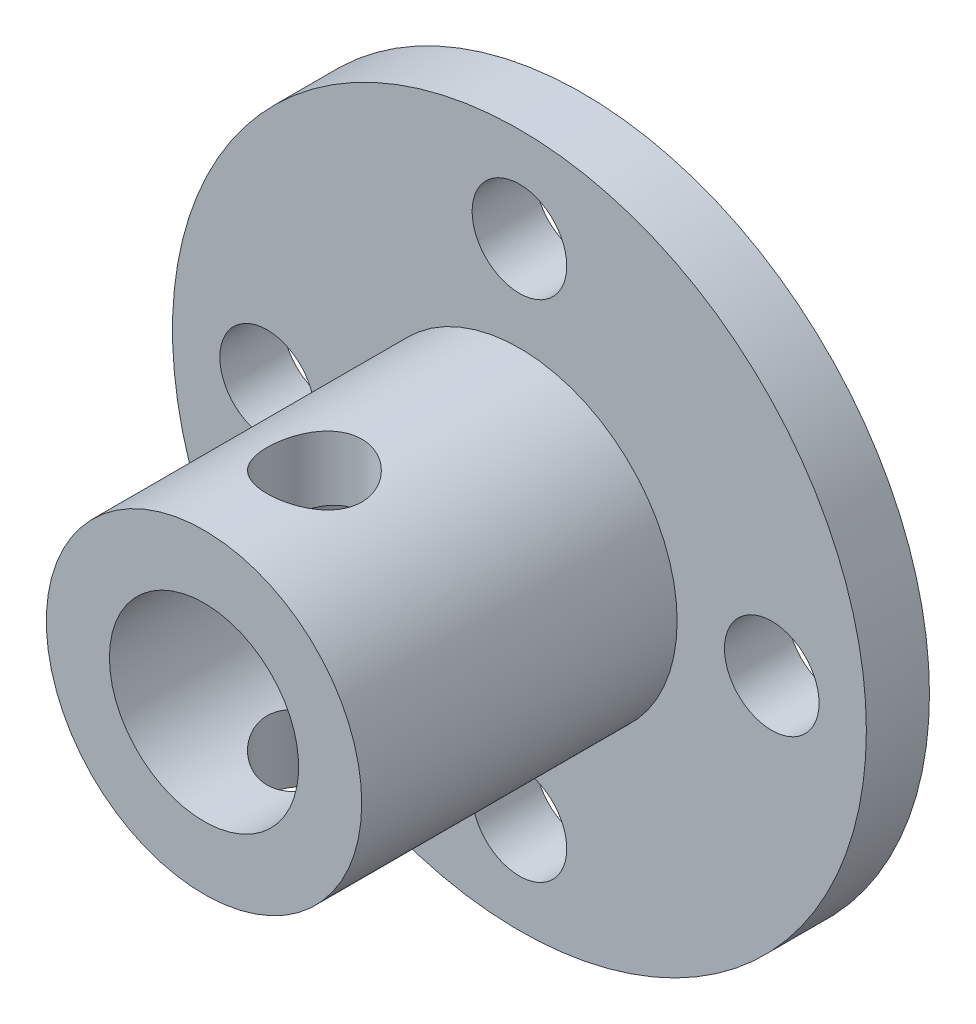
ISO-10303-21;
HEADER;
FILE_DESCRIPTION(('STEP AP214'),'2;1');
FILE_NAME('part.step','',(''),(''),'','','');
FILE_SCHEMA(('AUTOMOTIVE_DESIGN { 1 0 10303 214 1 1 1 1 }'));
ENDSEC;
DATA;
#1=APPLICATION_CONTEXT('core data for automotive mechanical design processes');
#2=APPLICATION_PROTOCOL_DEFINITION('international standard','automotive_design',2000,#1);
#3=PRODUCT_CONTEXT('',#1,'mechanical');
#4=PRODUCT('Part','Part','',(#3));
#5=PRODUCT_RELATED_PRODUCT_CATEGORY('part','',(#4));
#6=PRODUCT_DEFINITION_FORMATION('','',#4);
#7=PRODUCT_DEFINITION_CONTEXT('part definition',#1,'design');
#8=PRODUCT_DEFINITION('design','',#6,#7);
#9=PRODUCT_DEFINITION_SHAPE('','',#8);
#10=(LENGTH_UNIT() NAMED_UNIT(*) SI_UNIT(.MILLI.,.METRE.));
#11=(NAMED_UNIT(*) PLANE_ANGLE_UNIT() SI_UNIT($,.RADIAN.));
#12=(NAMED_UNIT(*) SI_UNIT($,.STERADIAN.) SOLID_ANGLE_UNIT());
#13=UNCERTAINTY_MEASURE_WITH_UNIT(LENGTH_MEASURE(1.E-05),#10,'distance_accuracy_value','');
#14=(GEOMETRIC_REPRESENTATION_CONTEXT(3) GLOBAL_UNCERTAINTY_ASSIGNED_CONTEXT((#13)) GLOBAL_UNIT_ASSIGNED_CONTEXT((#10,
#11,#12)) REPRESENTATION_CONTEXT('',''));
#15=CARTESIAN_POINT('',(0.,0.,0.));
#16=DIRECTION('',(0.,0.,1.));
#17=DIRECTION('',(1.,0.,0.));
#18=AXIS2_PLACEMENT_3D('',#15,#16,#17);
#19=CARTESIAN_POINT('',(0.,0.,12.));
#20=DIRECTION('',(0.,0.,-1.));
#21=DIRECTION('',(-1.,0.,0.));
#22=AXIS2_PLACEMENT_3D('',#19,#20,#21);
#23=CYLINDRICAL_SURFACE('',#22,5.);
#24=CARTESIAN_POINT('',(0.,0.,12.));
#25=DIRECTION('',(0.,0.,1.));
#26=DIRECTION('',(1.,0.,0.));
#27=AXIS2_PLACEMENT_3D('',#24,#25,#26);
#28=CIRCLE('',#27,5.);
#29=CARTESIAN_POINT('',(5.,0.,12.));
#30=VERTEX_POINT('',#29);
#31=EDGE_CURVE('E60',#30,#30,#28,.T.);
#32=ORIENTED_EDGE('',*,*,#31,.F.);
#33=EDGE_LOOP('',(#32));
#34=FACE_BOUND('',#33,.T.);
#35=CARTESIAN_POINT('',(0.,0.,2.));
#36=DIRECTION('',(0.,0.,1.));
#37=DIRECTION('',(1.,0.,0.));
#38=AXIS2_PLACEMENT_3D('',#35,#36,#37);
#39=CIRCLE('',#38,5.);
#40=CARTESIAN_POINT('',(5.,0.,2.));
#41=VERTEX_POINT('',#40);
#42=EDGE_CURVE('E10',#41,#41,#39,.T.);
#43=ORIENTED_EDGE('',*,*,#42,.T.);
#44=EDGE_LOOP('',(#43));
#45=FACE_BOUND('',#44,.T.);
#46=CARTESIAN_POINT('',(0.,-5.,7.));
#47=CARTESIAN_POINT('',(0.0822886127532999,-4.9999992925055,7.00000099748489));
#48=CARTESIAN_POINT('',(0.164587318351529,-4.99794915693954,7.00679386362397));
#49=CARTESIAN_POINT('',(0.326788125304881,-4.98997105593691,7.0337213542221));
#50=CARTESIAN_POINT('',(0.40668950441142,-4.98404193389692,7.05385995802334));
#51=CARTESIAN_POINT('',(0.561732707754526,-4.96895552501836,7.10674601691026));
#52=CARTESIAN_POINT('',(0.636881364395373,-4.95980300250425,7.13947486961894));
#53=CARTESIAN_POINT('',(0.780624181053131,-4.93922109237645,7.21653609305584));
#54=CARTESIAN_POINT('',(0.849217467469669,-4.92779140192067,7.26087000739542));
#55=CARTESIAN_POINT('',(0.979871797183745,-4.90350737192774,7.36122400747267));
#56=CARTESIAN_POINT('',(1.04171807124434,-4.89062383657036,7.41751662588591));
#57=CARTESIAN_POINT('',(1.15524920923324,-4.86505834210442,7.53960922991018));
#58=CARTESIAN_POINT('',(1.20693236327441,-4.85237641724501,7.60541081212496));
#59=CARTESIAN_POINT('',(1.29980037723708,-4.82834113993772,7.74647075303761));
#60=CARTESIAN_POINT('',(1.34072309022213,-4.81702406663875,7.82190846099074));
#61=CARTESIAN_POINT('',(1.4092139477476,-4.79743620394031,7.97898925423029));
#62=CARTESIAN_POINT('',(1.43678529919973,-4.78916468313311,8.06063084392798));
#63=CARTESIAN_POINT('',(1.47701633682652,-4.77690870838434,8.22539026613046));
#64=CARTESIAN_POINT('',(1.49007196234677,-4.77281069324533,8.30840274386394));
#65=CARTESIAN_POINT('',(1.50213730614672,-4.76902789749767,8.47553315621677));
#66=CARTESIAN_POINT('',(1.50115042761078,-4.76934204760571,8.55965081805909));
#67=CARTESIAN_POINT('',(1.48546977199812,-4.77424744067778,8.72338390860848));
#68=CARTESIAN_POINT('',(1.47127205262685,-4.7786838859914,8.80305225036224));
#69=CARTESIAN_POINT('',(1.43037420427056,-4.79108356228624,8.95881978627346));
#70=CARTESIAN_POINT('',(1.40367284141641,-4.79904714132351,9.03491862737433));
#71=CARTESIAN_POINT('',(1.33816026653682,-4.81772733074973,9.18260034966074));
#72=CARTESIAN_POINT('',(1.29918816934642,-4.82848016115952,9.25410708395526));
#73=CARTESIAN_POINT('',(1.21035222588683,-4.85150987000065,9.38973202201019));
#74=CARTESIAN_POINT('',(1.16048574002588,-4.86378711746991,9.45384842941378));
#75=CARTESIAN_POINT('',(1.04881290765546,-4.88911011297937,9.57568619076202));
#76=CARTESIAN_POINT('',(0.986594907466971,-4.90216654310498,9.63302866402967));
#77=CARTESIAN_POINT('',(0.853263259313966,-4.92712244063259,9.73655398406425));
#78=CARTESIAN_POINT('',(0.782149051860887,-4.9390218351841,9.78273612841443));
#79=CARTESIAN_POINT('',(0.632355038342802,-4.9604316006947,9.86285992246473));
#80=CARTESIAN_POINT('',(0.553627749747949,-4.96992543668314,9.89671751624986));
#81=CARTESIAN_POINT('',(0.391245415603518,-4.98533521832222,9.95059959009963));
#82=CARTESIAN_POINT('',(0.30759175158958,-4.99125216186999,9.97062792853249));
#83=CARTESIAN_POINT('',(0.14095224266833,-4.99868364643538,9.9956521778994));
#84=CARTESIAN_POINT('',(0.0580500976011859,-5.0003485041779,10.0011615858016));
#85=CARTESIAN_POINT('',(-0.107499605823384,-4.9995292324176,9.99843084428792));
#86=CARTESIAN_POINT('',(-0.190147196690782,-4.99704565677756,9.99019253034856));
#87=CARTESIAN_POINT('',(-0.350903605309697,-4.98830696987163,9.9606153888885));
#88=CARTESIAN_POINT('',(-0.429072772614169,-4.98213829799417,9.93957661241913));
#89=CARTESIAN_POINT('',(-0.580754638954522,-4.96674347841533,9.8853567672218));
#90=CARTESIAN_POINT('',(-0.654266777025584,-4.95751696321085,9.85217423896214));
#91=CARTESIAN_POINT('',(-0.796437189461053,-4.93669654351325,9.77374683451887));
#92=CARTESIAN_POINT('',(-0.86494382619967,-4.92505280829675,9.72824065905203));
#93=CARTESIAN_POINT('',(-0.993523307980148,-4.90073468764317,9.62677524594719));
#94=CARTESIAN_POINT('',(-1.05359403235594,-4.8880600443108,9.57081338811233));
#95=CARTESIAN_POINT('',(-1.16585744551027,-4.86253171869138,9.44761269163065));
#96=CARTESIAN_POINT('',(-1.21768481231504,-4.84968825033268,9.38003812422826));
#97=CARTESIAN_POINT('',(-1.30928995072154,-4.82576515238463,9.23687206098647));
#98=CARTESIAN_POINT('',(-1.34906803829472,-4.81468547654651,9.16128077544179));
#99=CARTESIAN_POINT('',(-1.41517347127168,-4.79567189615055,9.00446750874531));
#100=CARTESIAN_POINT('',(-1.4415634693705,-4.78772337843827,8.92327381346341));
#101=CARTESIAN_POINT('',(-1.48021730815114,-4.77591594362794,8.75731203106852));
#102=CARTESIAN_POINT('',(-1.49248598978779,-4.772055625083,8.67254517921233));
#103=CARTESIAN_POINT('',(-1.50221984485059,-4.76899972496087,8.50563848162377));
#104=CARTESIAN_POINT('',(-1.5002805530849,-4.76961647442754,8.42353634898241));
#105=CARTESIAN_POINT('',(-1.48307505444813,-4.77499401288294,8.2608858966272));
#106=CARTESIAN_POINT('',(-1.46780938124716,-4.77975463592551,8.18033751482364));
#107=CARTESIAN_POINT('',(-1.42476888804136,-4.79275763670385,8.02405460085715));
#108=CARTESIAN_POINT('',(-1.39715175507068,-4.80095604545965,7.94827271263831));
#109=CARTESIAN_POINT('',(-1.33031507121129,-4.81990278909136,7.80235756118228));
#110=CARTESIAN_POINT('',(-1.29109329962876,-4.83065161194312,7.73222538235924));
#111=CARTESIAN_POINT('',(-1.20048763805072,-4.85397676425833,7.59683688347289));
#112=CARTESIAN_POINT('',(-1.14871276092994,-4.86660540163798,7.53185123873959));
#113=CARTESIAN_POINT('',(-1.03517434629782,-4.89201320450026,7.41129750169214));
#114=CARTESIAN_POINT('',(-0.973408217134501,-4.90479240823905,7.35573186053224));
#115=CARTESIAN_POINT('',(-0.839465762183248,-4.92950936570649,7.25397658770497));
#116=CARTESIAN_POINT('',(-0.767037885790608,-4.94141159765674,7.20810855314451));
#117=CARTESIAN_POINT('',(-0.615141373983529,-4.96260680455813,7.12926483009598));
#118=CARTESIAN_POINT('',(-0.535676052998954,-4.97190099931067,7.09628311172549));
#119=CARTESIAN_POINT('',(-0.380757712655281,-4.98602174969301,7.04710472434725));
#120=CARTESIAN_POINT('',(-0.305786961954234,-4.99122027381068,7.02948832711675));
#121=CARTESIAN_POINT('',(-0.15388019523078,-4.99820944494492,7.00593647475842));
#122=CARTESIAN_POINT('',(-0.0769445098581397,-5.0000006615474,6.99999906729518));
#123=CARTESIAN_POINT('',(0.,-5.,7.));
#124=B_SPLINE_CURVE_WITH_KNOTS('',3,(#46,#47,#48,#49,#50,#51,#52,#53,#54,#55,#56,#57,#58,#59,
#60,#61,#62,#63,#64,#65,#66,#67,#68,#69,#70,#71,#72,#73,#74,#75,#76,#77,#78,#79,#80,#81,#82,#83,
#84,#85,#86,#87,#88,#89,#90,#91,#92,#93,#94,#95,#96,#97,#98,#99,#100,#101,#102,#103,#104,#105,
#106,#107,#108,#109,#110,#111,#112,#113,#114,#115,#116,#117,#118,#119,#120,#121,#122,#123),
.UNSPECIFIED.,.T.,.F.,(4,2,2,2,2,2,2,2,2,2,2,2,2,2,2,2,2,2,2,2,2,2,2,2,2,2,2,2,2,2,2,2,2,2,2,2,
2,2,4),(0.,0.24658320361261,0.493239964845999,0.739533676300874,0.985860164412702,
1.23855602948191,1.49129437288633,1.74971481004109,2.00807314543224,2.25919689356599,
2.51025978319089,2.75226016697676,2.99428443658001,3.2396242644712,3.48502360158556,
3.74067104048167,3.99633456531072,4.25371046881689,4.51101453528808,4.75908809438545,
5.00712853550327,5.24956746682327,5.49203554593729,5.74011305702908,5.98825282000191,
6.24540400322819,6.50254844252681,6.75847814951252,7.01432009460283,7.25950155466943,
7.504673196616,7.74680040402721,7.98897397553107,8.23996925679931,8.49102974897502,
8.74942996156671,9.00770911595235,9.23831691930459,9.46888616948874),.UNSPECIFIED.);
#125=CARTESIAN_POINT('',(0.,-5.,7.));
#126=VERTEX_POINT('',#125);
#127=EDGE_CURVE('E88',#126,#126,#124,.T.);
#128=ORIENTED_EDGE('',*,*,#127,.F.);
#129=EDGE_LOOP('',(#128));
#130=FACE_BOUND('',#129,.T.);
#131=CARTESIAN_POINT('',(0.,5.,7.));
#132=CARTESIAN_POINT('',(-0.0822886127532999,4.9999992925055,7.00000099748489));
#133=CARTESIAN_POINT('',(-0.164587318351529,4.99794915693954,7.00679386362397));
#134=CARTESIAN_POINT('',(-0.326788125304881,4.98997105593691,7.0337213542221));
#135=CARTESIAN_POINT('',(-0.40668950441142,4.98404193389692,7.05385995802334));
#136=CARTESIAN_POINT('',(-0.561732707754526,4.96895552501836,7.10674601691026));
#137=CARTESIAN_POINT('',(-0.636881364395373,4.95980300250425,7.13947486961894));
#138=CARTESIAN_POINT('',(-0.780624181053131,4.93922109237645,7.21653609305584));
#139=CARTESIAN_POINT('',(-0.849217467469669,4.92779140192067,7.26087000739542));
#140=CARTESIAN_POINT('',(-0.979871797183745,4.90350737192774,7.36122400747267));
#141=CARTESIAN_POINT('',(-1.04171807124434,4.89062383657036,7.41751662588591));
#142=CARTESIAN_POINT('',(-1.15524920923324,4.86505834210442,7.53960922991018));
#143=CARTESIAN_POINT('',(-1.20693236327441,4.85237641724501,7.60541081212496));
#144=CARTESIAN_POINT('',(-1.29980037723708,4.82834113993772,7.74647075303761));
#145=CARTESIAN_POINT('',(-1.34072309022213,4.81702406663875,7.82190846099074));
#146=CARTESIAN_POINT('',(-1.4092139477476,4.79743620394031,7.97898925423029));
#147=CARTESIAN_POINT('',(-1.43678529919973,4.78916468313311,8.06063084392798));
#148=CARTESIAN_POINT('',(-1.47701633682652,4.77690870838434,8.22539026613046));
#149=CARTESIAN_POINT('',(-1.49007196234677,4.77281069324533,8.30840274386394));
#150=CARTESIAN_POINT('',(-1.50213730614672,4.76902789749767,8.47553315621677));
#151=CARTESIAN_POINT('',(-1.50115042761078,4.76934204760571,8.55965081805909));
#152=CARTESIAN_POINT('',(-1.48546977199812,4.77424744067778,8.72338390860848));
#153=CARTESIAN_POINT('',(-1.47127205262685,4.7786838859914,8.80305225036224));
#154=CARTESIAN_POINT('',(-1.43037420427056,4.79108356228624,8.95881978627346));
#155=CARTESIAN_POINT('',(-1.40367284141641,4.79904714132351,9.03491862737433));
#156=CARTESIAN_POINT('',(-1.33816026653682,4.81772733074973,9.18260034966074));
#157=CARTESIAN_POINT('',(-1.29918816934642,4.82848016115952,9.25410708395526));
#158=CARTESIAN_POINT('',(-1.21035222588683,4.85150987000065,9.38973202201019));
#159=CARTESIAN_POINT('',(-1.16048574002588,4.86378711746991,9.45384842941378));
#160=CARTESIAN_POINT('',(-1.04881290765546,4.88911011297937,9.57568619076202));
#161=CARTESIAN_POINT('',(-0.986594907466971,4.90216654310498,9.63302866402967));
#162=CARTESIAN_POINT('',(-0.853263259313966,4.92712244063259,9.73655398406425));
#163=CARTESIAN_POINT('',(-0.782149051860887,4.9390218351841,9.78273612841443));
#164=CARTESIAN_POINT('',(-0.632355038342802,4.9604316006947,9.86285992246473));
#165=CARTESIAN_POINT('',(-0.553627749747949,4.96992543668314,9.89671751624986));
#166=CARTESIAN_POINT('',(-0.391245415603518,4.98533521832222,9.95059959009963));
#167=CARTESIAN_POINT('',(-0.30759175158958,4.99125216186999,9.97062792853249));
#168=CARTESIAN_POINT('',(-0.14095224266833,4.99868364643538,9.9956521778994));
#169=CARTESIAN_POINT('',(-0.0580500976011859,5.0003485041779,10.0011615858016));
#170=CARTESIAN_POINT('',(0.107499605823384,4.9995292324176,9.99843084428792));
#171=CARTESIAN_POINT('',(0.190147196690782,4.99704565677756,9.99019253034856));
#172=CARTESIAN_POINT('',(0.350903605309697,4.98830696987163,9.9606153888885));
#173=CARTESIAN_POINT('',(0.429072772614169,4.98213829799417,9.93957661241913));
#174=CARTESIAN_POINT('',(0.580754638954522,4.96674347841533,9.8853567672218));
#175=CARTESIAN_POINT('',(0.654266777025584,4.95751696321085,9.85217423896214));
#176=CARTESIAN_POINT('',(0.796437189461053,4.93669654351325,9.77374683451887));
#177=CARTESIAN_POINT('',(0.86494382619967,4.92505280829675,9.72824065905203));
#178=CARTESIAN_POINT('',(0.993523307980148,4.90073468764317,9.62677524594719));
#179=CARTESIAN_POINT('',(1.05359403235594,4.8880600443108,9.57081338811233));
#180=CARTESIAN_POINT('',(1.16585744551027,4.86253171869138,9.44761269163065));
#181=CARTESIAN_POINT('',(1.21768481231504,4.84968825033268,9.38003812422826));
#182=CARTESIAN_POINT('',(1.30928995072154,4.82576515238463,9.23687206098647));
#183=CARTESIAN_POINT('',(1.34906803829472,4.81468547654651,9.16128077544179));
#184=CARTESIAN_POINT('',(1.41517347127168,4.79567189615055,9.00446750874531));
#185=CARTESIAN_POINT('',(1.4415634693705,4.78772337843827,8.92327381346341));
#186=CARTESIAN_POINT('',(1.48021730815114,4.77591594362794,8.75731203106852));
#187=CARTESIAN_POINT('',(1.49248598978779,4.772055625083,8.67254517921233));
#188=CARTESIAN_POINT('',(1.50221984485059,4.76899972496087,8.50563848162377));
#189=CARTESIAN_POINT('',(1.5002805530849,4.76961647442754,8.42353634898241));
#190=CARTESIAN_POINT('',(1.48307505444813,4.77499401288294,8.2608858966272));
#191=CARTESIAN_POINT('',(1.46780938124716,4.77975463592551,8.18033751482364));
#192=CARTESIAN_POINT('',(1.42476888804136,4.79275763670385,8.02405460085715));
#193=CARTESIAN_POINT('',(1.39715175507068,4.80095604545965,7.94827271263831));
#194=CARTESIAN_POINT('',(1.33031507121129,4.81990278909136,7.80235756118228));
#195=CARTESIAN_POINT('',(1.29109329962876,4.83065161194312,7.73222538235924));
#196=CARTESIAN_POINT('',(1.20048763805072,4.85397676425833,7.59683688347289));
#197=CARTESIAN_POINT('',(1.14871276092994,4.86660540163798,7.53185123873959));
#198=CARTESIAN_POINT('',(1.03517434629782,4.89201320450026,7.41129750169214));
#199=CARTESIAN_POINT('',(0.973408217134501,4.90479240823905,7.35573186053224));
#200=CARTESIAN_POINT('',(0.839465762183248,4.92950936570649,7.25397658770497));
#201=CARTESIAN_POINT('',(0.767037885790608,4.94141159765674,7.20810855314451));
#202=CARTESIAN_POINT('',(0.615141373983529,4.96260680455813,7.12926483009598));
#203=CARTESIAN_POINT('',(0.535676052998954,4.97190099931067,7.09628311172549));
#204=CARTESIAN_POINT('',(0.380757712655281,4.98602174969301,7.04710472434725));
#205=CARTESIAN_POINT('',(0.305786961954234,4.99122027381068,7.02948832711675));
#206=CARTESIAN_POINT('',(0.15388019523078,4.99820944494492,7.00593647475842));
#207=CARTESIAN_POINT('',(0.0769445098581397,5.0000006615474,6.99999906729518));
#208=CARTESIAN_POINT('',(0.,5.,7.));
#209=B_SPLINE_CURVE_WITH_KNOTS('',3,(#131,#132,#133,#134,#135,#136,#137,#138,#139,#140,#141,
#142,#143,#144,#145,#146,#147,#148,#149,#150,#151,#152,#153,#154,#155,#156,#157,#158,#159,#160,
#161,#162,#163,#164,#165,#166,#167,#168,#169,#170,#171,#172,#173,#174,#175,#176,#177,#178,#179,
#180,#181,#182,#183,#184,#185,#186,#187,#188,#189,#190,#191,#192,#193,#194,#195,#196,#197,#198,
#199,#200,#201,#202,#203,#204,#205,#206,#207,#208),.UNSPECIFIED.,.T.,.F.,(4,2,2,2,2,2,2,2,2,2,2,
2,2,2,2,2,2,2,2,2,2,2,2,2,2,2,2,2,2,2,2,2,2,2,2,2,2,2,4),(0.,0.24658320361261,0.493239964845999,
0.739533676300874,0.985860164412702,1.23855602948191,1.49129437288633,1.74971481004109,
2.00807314543224,2.25919689356599,2.51025978319089,2.75226016697676,2.99428443658001,
3.2396242644712,3.48502360158556,3.74067104048167,3.99633456531072,4.25371046881689,
4.51101453528808,4.75908809438545,5.00712853550327,5.24956746682327,5.49203554593729,
5.74011305702908,5.98825282000191,6.24540400322819,6.50254844252681,6.75847814951252,
7.01432009460283,7.25950155466943,7.504673196616,7.74680040402721,7.98897397553107,
8.23996925679931,8.49102974897502,8.74942996156671,9.00770911595235,9.23831691930459,
9.46888616948874),.UNSPECIFIED.);
#210=CARTESIAN_POINT('',(0.,5.,7.));
#211=VERTEX_POINT('',#210);
#212=EDGE_CURVE('E95',#211,#211,#209,.T.);
#213=ORIENTED_EDGE('',*,*,#212,.F.);
#214=EDGE_LOOP('',(#213));
#215=FACE_BOUND('',#214,.T.);
#216=ADVANCED_FACE('F37',(#34,#45,#130,#215),#23,.T.);
#217=CARTESIAN_POINT('',(0.,0.,12.));
#218=DIRECTION('',(0.,0.,-1.));
#219=DIRECTION('',(-1.,0.,0.));
#220=AXIS2_PLACEMENT_3D('',#217,#218,#219);
#221=CYLINDRICAL_SURFACE('',#220,3.);
#222=CARTESIAN_POINT('',(0.,0.,12.));
#223=DIRECTION('',(0.,0.,-1.));
#224=DIRECTION('',(-1.,0.,0.));
#225=AXIS2_PLACEMENT_3D('',#222,#223,#224);
#226=CIRCLE('',#225,3.);
#227=CARTESIAN_POINT('',(-3.,0.,12.));
#228=VERTEX_POINT('',#227);
#229=EDGE_CURVE('E152',#228,#228,#226,.T.);
#230=ORIENTED_EDGE('',*,*,#229,.F.);
#231=EDGE_LOOP('',(#230));
#232=FACE_BOUND('',#231,.T.);
#233=CARTESIAN_POINT('',(0.,0.,0.));
#234=DIRECTION('',(0.,0.,-1.));
#235=DIRECTION('',(-1.,0.,0.));
#236=AXIS2_PLACEMENT_3D('',#233,#234,#235);
#237=CIRCLE('',#236,3.);
#238=CARTESIAN_POINT('',(-3.,0.,0.));
#239=VERTEX_POINT('',#238);
#240=EDGE_CURVE('E136',#239,#239,#237,.T.);
#241=ORIENTED_EDGE('',*,*,#240,.T.);
#242=EDGE_LOOP('',(#241));
#243=FACE_BOUND('',#242,.T.);
#244=CARTESIAN_POINT('',(0.,-3.,7.));
#245=CARTESIAN_POINT('',(-0.0788579444268502,-2.99999570107562,7.00000495347579));
#246=CARTESIAN_POINT('',(-0.157809899546344,-2.99685736529635,7.00625510968158));
#247=CARTESIAN_POINT('',(-0.313380352903344,-2.98461234055735,7.03097932051231));
#248=CARTESIAN_POINT('',(-0.389994130070444,-2.97549431743379,7.04947658949672));
#249=CARTESIAN_POINT('',(-0.538400317320673,-2.95224419105063,7.09779071292494));
#250=CARTESIAN_POINT('',(-0.610210204408719,-2.93813158766306,7.12756357637195));
#251=CARTESIAN_POINT('',(-0.747708925209898,-2.90618664773642,7.19735593204748));
#252=CARTESIAN_POINT('',(-0.813398240985089,-2.88835460450288,7.2373746163733));
#253=CARTESIAN_POINT('',(-0.941261726642864,-2.84934387387093,7.32927587422793));
#254=CARTESIAN_POINT('',(-1.00298281668316,-2.82802798691306,7.38172971885946));
#255=CARTESIAN_POINT('',(-1.11716916730047,-2.78489955370114,7.49578221887055));
#256=CARTESIAN_POINT('',(-1.16962737466015,-2.76308664313552,7.55738777765866));
#257=CARTESIAN_POINT('',(-1.26787800067542,-2.71948426796021,7.69372502428507));
#258=CARTESIAN_POINT('',(-1.31283800332746,-2.69782780455198,7.76910414751887));
#259=CARTESIAN_POINT('',(-1.38925234033604,-2.65928968158481,7.92755100397932));
#260=CARTESIAN_POINT('',(-1.4207163224495,-2.64240461410484,8.01061319308412));
#261=CARTESIAN_POINT('',(-1.46719866328288,-2.61686800556713,8.17699765813289));
#262=CARTESIAN_POINT('',(-1.48308878562066,-2.6077840737557,8.26000667810109));
#263=CARTESIAN_POINT('',(-1.50064048996327,-2.59772834922792,8.42796825666922));
#264=CARTESIAN_POINT('',(-1.50231613255961,-2.59674854014932,8.51291881130673));
#265=CARTESIAN_POINT('',(-1.49203093075844,-2.60266395385873,8.67142903647305));
#266=CARTESIAN_POINT('',(-1.48167683930523,-2.6086314549302,8.74513604683458));
#267=CARTESIAN_POINT('',(-1.4504097735854,-2.62614343100775,8.88958286405956));
#268=CARTESIAN_POINT('',(-1.42949343584648,-2.63768968247664,8.96032171795797));
#269=CARTESIAN_POINT('',(-1.37731467057901,-2.66531214619111,9.09884369884849));
#270=CARTESIAN_POINT('',(-1.34582260067399,-2.68148760995998,9.16651959817868));
#271=CARTESIAN_POINT('',(-1.273562531502,-2.71655106422105,9.29595143888501));
#272=CARTESIAN_POINT('',(-1.2327903657187,-2.73544027170286,9.35770470340013));
#273=CARTESIAN_POINT('',(-1.13709908236918,-2.77669736854929,9.48178187911484));
#274=CARTESIAN_POINT('',(-1.08104168755392,-2.79920265355119,9.54318531036424));
#275=CARTESIAN_POINT('',(-0.959333368112061,-2.84321434950611,9.65610312788635));
#276=CARTESIAN_POINT('',(-0.893677884861429,-2.86472027938201,9.70761278805082));
#277=CARTESIAN_POINT('',(-0.750774758747774,-2.90552980924446,9.80152849154459));
#278=CARTESIAN_POINT('',(-0.673130387399115,-2.92468476243011,9.84340070866861));
#279=CARTESIAN_POINT('',(-0.510699323233196,-2.95736821681863,9.91314554356451));
#280=CARTESIAN_POINT('',(-0.425918364397914,-2.9709011841533,9.94102927752275));
#281=CARTESIAN_POINT('',(-0.259149737491053,-2.98986500612153,9.97971310557502));
#282=CARTESIAN_POINT('',(-0.177512295822489,-2.99587407451965,9.99173685362017));
#283=CARTESIAN_POINT('',(-0.0131693999240271,-3.00109520188655,10.0021970967017));
#284=CARTESIAN_POINT('',(0.0695355298048634,-3.00031048081978,10.0006400284592));
#285=CARTESIAN_POINT('',(0.226849457978981,-2.99236788380152,9.98468996737189));
#286=CARTESIAN_POINT('',(0.301589112074895,-2.98570868532252,9.97130120090501));
#287=CARTESIAN_POINT('',(0.447610338452912,-2.9673325697226,9.93364289215732));
#288=CARTESIAN_POINT('',(0.518891528536631,-2.95561509501618,9.90937215031976));
#289=CARTESIAN_POINT('',(0.658332912674359,-2.92776377120382,9.85000230035045));
#290=CARTESIAN_POINT('',(0.726345595508705,-2.91151322654446,9.81461342482557));
#291=CARTESIAN_POINT('',(0.855692042548907,-2.87615961476126,9.73433869653015));
#292=CARTESIAN_POINT('',(0.917022944664887,-2.85705533350407,9.68944879810691));
#293=CARTESIAN_POINT('',(1.03765153393382,-2.81562332004297,9.58635936200393));
#294=CARTESIAN_POINT('',(1.09615811672854,-2.79316327265249,9.52728569733228));
#295=CARTESIAN_POINT('',(1.20278448167828,-2.7489358741323,9.40011227308341));
#296=CARTESIAN_POINT('',(1.25089707856781,-2.72716901100071,9.33200632172812));
#297=CARTESIAN_POINT('',(1.33756187171853,-2.68576788309734,9.18453451874054));
#298=CARTESIAN_POINT('',(1.37553824370037,-2.66628794383591,9.10478310085828));
#299=CARTESIAN_POINT('',(1.43712423890206,-2.63361108441202,8.93873489863755));
#300=CARTESIAN_POINT('',(1.46075237380052,-2.62040607332625,8.85244671029967));
#301=CARTESIAN_POINT('',(1.49079253120031,-2.60342251538703,8.68463466567295));
#302=CARTESIAN_POINT('',(1.49863949460818,-2.59886075197597,8.60344861984714));
#303=CARTESIAN_POINT('',(1.5010337315643,-2.59748031962405,8.44082939925321));
#304=CARTESIAN_POINT('',(1.49558676993486,-2.60065829439585,8.35939634689321));
#305=CARTESIAN_POINT('',(1.47288918838997,-2.61356793076615,8.20677474769985));
#306=CARTESIAN_POINT('',(1.45681247151455,-2.62264641723988,8.13534929478289));
#307=CARTESIAN_POINT('',(1.41476303733662,-2.64556524281479,7.99628782086345));
#308=CARTESIAN_POINT('',(1.38878713673988,-2.65940711354503,7.92865302686195));
#309=CARTESIAN_POINT('',(1.32572361795085,-2.69142795546803,7.7940627235202));
#310=CARTESIAN_POINT('',(1.28800670672355,-2.70983583593881,7.72745814725646));
#311=CARTESIAN_POINT('',(1.20322645745609,-2.7485299745229,7.60108819572811));
#312=CARTESIAN_POINT('',(1.15615825686234,-2.76881720693416,7.54132640421833));
#313=CARTESIAN_POINT('',(1.04730498999206,-2.81193484737138,7.42278702646799));
#314=CARTESIAN_POINT('',(0.984426634495893,-2.83477474959942,7.36501134647456));
#315=CARTESIAN_POINT('',(0.849232209349796,-2.87816628389896,7.2606055248471));
#316=CARTESIAN_POINT('',(0.776911084957797,-2.89871667939293,7.21398139079514));
#317=CARTESIAN_POINT('',(0.62389739517442,-2.93547014349806,7.13314545593189));
#318=CARTESIAN_POINT('',(0.543149255665097,-2.95164144740899,7.0990237461453));
#319=CARTESIAN_POINT('',(0.376113151707131,-2.9775201194848,7.04528774836389));
#320=CARTESIAN_POINT('',(0.289841699383651,-2.98724585044602,7.02563222979143));
#321=CARTESIAN_POINT('',(0.168902919736344,-2.99543192870217,7.00915388337139));
#322=CARTESIAN_POINT('',(0.135242819162348,-2.99714048010376,7.00572603870049));
#323=CARTESIAN_POINT('',(0.0677275977076378,-2.99942545465223,7.00114800172887));
#324=CARTESIAN_POINT('',(0.0338724714699429,-3.00000184655071,6.99999787229469));
#325=CARTESIAN_POINT('',(0.,-3.,7.));
#326=B_SPLINE_CURVE_WITH_KNOTS('',3,(#244,#245,#246,#247,#248,#249,#250,#251,#252,#253,#254,
#255,#256,#257,#258,#259,#260,#261,#262,#263,#264,#265,#266,#267,#268,#269,#270,#271,#272,#273,
#274,#275,#276,#277,#278,#279,#280,#281,#282,#283,#284,#285,#286,#287,#288,#289,#290,#291,#292,
#293,#294,#295,#296,#297,#298,#299,#300,#301,#302,#303,#304,#305,#306,#307,#308,#309,#310,#311,
#312,#313,#314,#315,#316,#317,#318,#319,#320,#321,#322,#323,#324,#325),.UNSPECIFIED.,.T.,.F.,(4,
2,2,2,2,2,2,2,2,2,2,2,2,2,2,2,2,2,2,2,2,2,2,2,2,2,2,2,2,2,2,2,2,2,2,2,2,2,2,2,4),(0.,
0.236436386130439,0.473322224563796,0.709293233238447,0.945245640872351,1.19547263807713,
1.44588935648105,1.71572589646129,1.98536921847421,2.23887018210345,2.49212035993531,
2.71508568613981,2.93812205888518,3.16635360252731,3.39468781890333,3.65197412000818,
3.90938301898029,4.17874533321661,4.4478932536842,4.69474935707019,4.94148846767214,
5.16910359759183,5.39674382446397,5.63089284041848,5.86514176122509,6.12239415966628,
6.37982382923148,6.64972023242588,6.91926767918176,7.1629396125457,7.40650589797017,
7.62686895373283,7.84730293182526,8.08254685170431,8.31791341715446,8.58187864135757,
8.84598575071869,9.1119602049529,9.37717362931724,9.47872920200875,9.58028757766599),.UNSPECIFIED.);
#327=CARTESIAN_POINT('',(0.,-3.,7.));
#328=VERTEX_POINT('',#327);
#329=EDGE_CURVE('E65',#328,#328,#326,.T.);
#330=ORIENTED_EDGE('',*,*,#329,.F.);
#331=EDGE_LOOP('',(#330));
#332=FACE_BOUND('',#331,.T.);
#333=CARTESIAN_POINT('',(0.,3.,7.));
#334=CARTESIAN_POINT('',(0.0788579444268502,2.99999570107562,7.00000495347579));
#335=CARTESIAN_POINT('',(0.157809899546344,2.99685736529635,7.00625510968158));
#336=CARTESIAN_POINT('',(0.313380352903344,2.98461234055735,7.03097932051231));
#337=CARTESIAN_POINT('',(0.389994130070444,2.97549431743379,7.04947658949672));
#338=CARTESIAN_POINT('',(0.538400317320673,2.95224419105063,7.09779071292494));
#339=CARTESIAN_POINT('',(0.610210204408719,2.93813158766306,7.12756357637195));
#340=CARTESIAN_POINT('',(0.747708925209898,2.90618664773642,7.19735593204748));
#341=CARTESIAN_POINT('',(0.813398240985089,2.88835460450288,7.2373746163733));
#342=CARTESIAN_POINT('',(0.941261726642864,2.84934387387093,7.32927587422793));
#343=CARTESIAN_POINT('',(1.00298281668316,2.82802798691306,7.38172971885946));
#344=CARTESIAN_POINT('',(1.11716916730047,2.78489955370114,7.49578221887055));
#345=CARTESIAN_POINT('',(1.16962737466015,2.76308664313552,7.55738777765866));
#346=CARTESIAN_POINT('',(1.26787800067542,2.71948426796021,7.69372502428507));
#347=CARTESIAN_POINT('',(1.31283800332746,2.69782780455198,7.76910414751887));
#348=CARTESIAN_POINT('',(1.38925234033604,2.65928968158481,7.92755100397932));
#349=CARTESIAN_POINT('',(1.4207163224495,2.64240461410484,8.01061319308412));
#350=CARTESIAN_POINT('',(1.46719866328288,2.61686800556713,8.17699765813289));
#351=CARTESIAN_POINT('',(1.48308878562066,2.6077840737557,8.26000667810109));
#352=CARTESIAN_POINT('',(1.50064048996327,2.59772834922792,8.42796825666922));
#353=CARTESIAN_POINT('',(1.50231613255961,2.59674854014932,8.51291881130673));
#354=CARTESIAN_POINT('',(1.49203093075844,2.60266395385873,8.67142903647305));
#355=CARTESIAN_POINT('',(1.48167683930523,2.6086314549302,8.74513604683458));
#356=CARTESIAN_POINT('',(1.4504097735854,2.62614343100775,8.88958286405956));
#357=CARTESIAN_POINT('',(1.42949343584648,2.63768968247664,8.96032171795797));
#358=CARTESIAN_POINT('',(1.37731467057901,2.66531214619111,9.09884369884849));
#359=CARTESIAN_POINT('',(1.34582260067399,2.68148760995998,9.16651959817868));
#360=CARTESIAN_POINT('',(1.273562531502,2.71655106422105,9.29595143888501));
#361=CARTESIAN_POINT('',(1.2327903657187,2.73544027170286,9.35770470340013));
#362=CARTESIAN_POINT('',(1.13709908236918,2.77669736854929,9.48178187911484));
#363=CARTESIAN_POINT('',(1.08104168755392,2.79920265355119,9.54318531036424));
#364=CARTESIAN_POINT('',(0.959333368112061,2.84321434950611,9.65610312788635));
#365=CARTESIAN_POINT('',(0.893677884861429,2.86472027938201,9.70761278805082));
#366=CARTESIAN_POINT('',(0.750774758747774,2.90552980924446,9.80152849154459));
#367=CARTESIAN_POINT('',(0.673130387399115,2.92468476243011,9.84340070866861));
#368=CARTESIAN_POINT('',(0.510699323233196,2.95736821681863,9.91314554356451));
#369=CARTESIAN_POINT('',(0.425918364397914,2.9709011841533,9.94102927752275));
#370=CARTESIAN_POINT('',(0.259149737491053,2.98986500612153,9.97971310557502));
#371=CARTESIAN_POINT('',(0.177512295822489,2.99587407451965,9.99173685362017));
#372=CARTESIAN_POINT('',(0.0131693999240271,3.00109520188655,10.0021970967017));
#373=CARTESIAN_POINT('',(-0.0695355298048634,3.00031048081978,10.0006400284592));
#374=CARTESIAN_POINT('',(-0.226849457978981,2.99236788380152,9.98468996737189));
#375=CARTESIAN_POINT('',(-0.301589112074895,2.98570868532252,9.97130120090501));
#376=CARTESIAN_POINT('',(-0.447610338452912,2.9673325697226,9.93364289215732));
#377=CARTESIAN_POINT('',(-0.518891528536631,2.95561509501618,9.90937215031976));
#378=CARTESIAN_POINT('',(-0.658332912674359,2.92776377120382,9.85000230035045));
#379=CARTESIAN_POINT('',(-0.726345595508705,2.91151322654446,9.81461342482557));
#380=CARTESIAN_POINT('',(-0.855692042548907,2.87615961476126,9.73433869653015));
#381=CARTESIAN_POINT('',(-0.917022944664887,2.85705533350407,9.68944879810691));
#382=CARTESIAN_POINT('',(-1.03765153393382,2.81562332004297,9.58635936200393));
#383=CARTESIAN_POINT('',(-1.09615811672854,2.79316327265249,9.52728569733228));
#384=CARTESIAN_POINT('',(-1.20278448167828,2.7489358741323,9.40011227308341));
#385=CARTESIAN_POINT('',(-1.25089707856781,2.72716901100071,9.33200632172812));
#386=CARTESIAN_POINT('',(-1.33756187171853,2.68576788309734,9.18453451874054));
#387=CARTESIAN_POINT('',(-1.37553824370037,2.66628794383591,9.10478310085828));
#388=CARTESIAN_POINT('',(-1.43712423890206,2.63361108441202,8.93873489863755));
#389=CARTESIAN_POINT('',(-1.46075237380052,2.62040607332625,8.85244671029967));
#390=CARTESIAN_POINT('',(-1.49079253120031,2.60342251538703,8.68463466567295));
#391=CARTESIAN_POINT('',(-1.49863949460818,2.59886075197597,8.60344861984714));
#392=CARTESIAN_POINT('',(-1.5010337315643,2.59748031962405,8.44082939925321));
#393=CARTESIAN_POINT('',(-1.49558676993486,2.60065829439585,8.35939634689321));
#394=CARTESIAN_POINT('',(-1.47288918838997,2.61356793076615,8.20677474769985));
#395=CARTESIAN_POINT('',(-1.45681247151455,2.62264641723988,8.13534929478289));
#396=CARTESIAN_POINT('',(-1.41476303733662,2.64556524281479,7.99628782086345));
#397=CARTESIAN_POINT('',(-1.38878713673988,2.65940711354503,7.92865302686195));
#398=CARTESIAN_POINT('',(-1.32572361795085,2.69142795546803,7.7940627235202));
#399=CARTESIAN_POINT('',(-1.28800670672355,2.70983583593881,7.72745814725646));
#400=CARTESIAN_POINT('',(-1.20322645745609,2.7485299745229,7.60108819572811));
#401=CARTESIAN_POINT('',(-1.15615825686234,2.76881720693416,7.54132640421833));
#402=CARTESIAN_POINT('',(-1.04730498999206,2.81193484737138,7.42278702646799));
#403=CARTESIAN_POINT('',(-0.984426634495893,2.83477474959942,7.36501134647456));
#404=CARTESIAN_POINT('',(-0.849232209349796,2.87816628389896,7.2606055248471));
#405=CARTESIAN_POINT('',(-0.776911084957797,2.89871667939293,7.21398139079514));
#406=CARTESIAN_POINT('',(-0.62389739517442,2.93547014349806,7.13314545593189));
#407=CARTESIAN_POINT('',(-0.543149255665097,2.95164144740899,7.0990237461453));
#408=CARTESIAN_POINT('',(-0.376113151707131,2.9775201194848,7.04528774836389));
#409=CARTESIAN_POINT('',(-0.289841699383651,2.98724585044602,7.02563222979143));
#410=CARTESIAN_POINT('',(-0.168902919736344,2.99543192870217,7.00915388337139));
#411=CARTESIAN_POINT('',(-0.135242819162348,2.99714048010376,7.00572603870049));
#412=CARTESIAN_POINT('',(-0.0677275977076378,2.99942545465223,7.00114800172887));
#413=CARTESIAN_POINT('',(-0.0338724714699429,3.00000184655071,6.99999787229469));
#414=CARTESIAN_POINT('',(0.,3.,7.));
#415=B_SPLINE_CURVE_WITH_KNOTS('',3,(#333,#334,#335,#336,#337,#338,#339,#340,#341,#342,#343,
#344,#345,#346,#347,#348,#349,#350,#351,#352,#353,#354,#355,#356,#357,#358,#359,#360,#361,#362,
#363,#364,#365,#366,#367,#368,#369,#370,#371,#372,#373,#374,#375,#376,#377,#378,#379,#380,#381,
#382,#383,#384,#385,#386,#387,#388,#389,#390,#391,#392,#393,#394,#395,#396,#397,#398,#399,#400,
#401,#402,#403,#404,#405,#406,#407,#408,#409,#410,#411,#412,#413,#414),.UNSPECIFIED.,.T.,.F.,(4,
2,2,2,2,2,2,2,2,2,2,2,2,2,2,2,2,2,2,2,2,2,2,2,2,2,2,2,2,2,2,2,2,2,2,2,2,2,2,2,4),(0.,
0.236436386130439,0.473322224563796,0.709293233238447,0.945245640872351,1.19547263807713,
1.44588935648105,1.71572589646129,1.98536921847421,2.23887018210345,2.49212035993531,
2.71508568613981,2.93812205888518,3.16635360252731,3.39468781890333,3.65197412000818,
3.90938301898029,4.17874533321661,4.4478932536842,4.69474935707019,4.94148846767214,
5.16910359759183,5.39674382446397,5.63089284041848,5.86514176122509,6.12239415966628,
6.37982382923148,6.64972023242588,6.91926767918176,7.1629396125457,7.40650589797017,
7.62686895373283,7.84730293182526,8.08254685170431,8.31791341715446,8.58187864135757,
8.84598575071869,9.1119602049529,9.37717362931724,9.47872920200875,9.58028757766599),.UNSPECIFIED.);
#416=CARTESIAN_POINT('',(0.,3.,7.));
#417=VERTEX_POINT('',#416);
#418=EDGE_CURVE('E41',#417,#417,#415,.T.);
#419=ORIENTED_EDGE('',*,*,#418,.F.);
#420=EDGE_LOOP('',(#419));
#421=FACE_BOUND('',#420,.T.);
#422=ADVANCED_FACE('F71',(#232,#243,#332,#421),#221,.F.);
#423=CARTESIAN_POINT('',(0.,0.,2.));
#424=DIRECTION('',(0.,0.,-1.));
#425=DIRECTION('',(-1.,0.,0.));
#426=AXIS2_PLACEMENT_3D('',#423,#424,#425);
#427=CYLINDRICAL_SURFACE('',#426,11.);
#428=CARTESIAN_POINT('',(0.,0.,2.));
#429=DIRECTION('',(0.,0.,1.));
#430=DIRECTION('',(1.,0.,0.));
#431=AXIS2_PLACEMENT_3D('',#428,#429,#430);
#432=CIRCLE('',#431,11.);
#433=CARTESIAN_POINT('',(11.,0.,2.));
#434=VERTEX_POINT('',#433);
#435=EDGE_CURVE('E51',#434,#434,#432,.T.);
#436=ORIENTED_EDGE('',*,*,#435,.F.);
#437=EDGE_LOOP('',(#436));
#438=FACE_BOUND('',#437,.T.);
#439=CARTESIAN_POINT('',(0.,0.,0.));
#440=DIRECTION('',(0.,0.,1.));
#441=DIRECTION('',(1.,0.,0.));
#442=AXIS2_PLACEMENT_3D('',#439,#440,#441);
#443=CIRCLE('',#442,11.);
#444=CARTESIAN_POINT('',(11.,0.,0.));
#445=VERTEX_POINT('',#444);
#446=EDGE_CURVE('E57',#445,#445,#443,.T.);
#447=ORIENTED_EDGE('',*,*,#446,.T.);
#448=EDGE_LOOP('',(#447));
#449=FACE_BOUND('',#448,.T.);
#450=ADVANCED_FACE('F39',(#438,#449),#427,.T.);
#451=CARTESIAN_POINT('',(0.,0.,2.));
#452=DIRECTION('',(0.,0.,1.));
#453=DIRECTION('',(1.,0.,0.));
#454=AXIS2_PLACEMENT_3D('',#451,#452,#453);
#455=PLANE('',#454);
#456=CARTESIAN_POINT('',(0.,8.,2.));
#457=DIRECTION('',(0.,0.,1.));
#458=DIRECTION('',(1.,0.,0.));
#459=AXIS2_PLACEMENT_3D('',#456,#457,#458);
#460=CIRCLE('',#459,1.5);
#461=CARTESIAN_POINT('',(1.5,8.,2.));
#462=VERTEX_POINT('',#461);
#463=EDGE_CURVE('E184',#462,#462,#460,.T.);
#464=ORIENTED_EDGE('',*,*,#463,.F.);
#465=EDGE_LOOP('',(#464));
#466=FACE_BOUND('',#465,.T.);
#467=CARTESIAN_POINT('',(-8.,0.,2.));
#468=DIRECTION('',(0.,0.,1.));
#469=DIRECTION('',(1.,0.,0.));
#470=AXIS2_PLACEMENT_3D('',#467,#468,#469);
#471=CIRCLE('',#470,1.5);
#472=CARTESIAN_POINT('',(-6.5,0.,2.));
#473=VERTEX_POINT('',#472);
#474=EDGE_CURVE('E180',#473,#473,#471,.T.);
#475=ORIENTED_EDGE('',*,*,#474,.F.);
#476=EDGE_LOOP('',(#475));
#477=FACE_BOUND('',#476,.T.);
#478=CARTESIAN_POINT('',(0.,-8.,2.));
#479=DIRECTION('',(0.,0.,1.));
#480=DIRECTION('',(1.,0.,0.));
#481=AXIS2_PLACEMENT_3D('',#478,#479,#480);
#482=CIRCLE('',#481,1.5);
#483=CARTESIAN_POINT('',(1.5,-8.,2.));
#484=VERTEX_POINT('',#483);
#485=EDGE_CURVE('E176',#484,#484,#482,.T.);
#486=ORIENTED_EDGE('',*,*,#485,.F.);
#487=EDGE_LOOP('',(#486));
#488=FACE_BOUND('',#487,.T.);
#489=CARTESIAN_POINT('',(8.,0.,2.));
#490=DIRECTION('',(0.,0.,1.));
#491=DIRECTION('',(1.,0.,0.));
#492=AXIS2_PLACEMENT_3D('',#489,#490,#491);
#493=CIRCLE('',#492,1.5);
#494=CARTESIAN_POINT('',(9.5,0.,2.));
#495=VERTEX_POINT('',#494);
#496=EDGE_CURVE('E172',#495,#495,#493,.T.);
#497=ORIENTED_EDGE('',*,*,#496,.F.);
#498=EDGE_LOOP('',(#497));
#499=FACE_BOUND('',#498,.T.);
#500=ORIENTED_EDGE('',*,*,#42,.F.);
#501=EDGE_LOOP('',(#500));
#502=FACE_BOUND('',#501,.T.);
#503=ORIENTED_EDGE('',*,*,#435,.T.);
#504=EDGE_LOOP('',(#503));
#505=FACE_BOUND('',#504,.T.);
#506=ADVANCED_FACE('F105',(#466,#477,#488,#499,#502,#505),#455,.T.);
#507=CARTESIAN_POINT('',(0.,0.,0.));
#508=DIRECTION('',(0.,0.,1.));
#509=DIRECTION('',(1.,0.,0.));
#510=AXIS2_PLACEMENT_3D('',#507,#508,#509);
#511=PLANE('',#510);
#512=CARTESIAN_POINT('',(0.,8.,0.));
#513=DIRECTION('',(0.,0.,-1.));
#514=DIRECTION('',(-1.,0.,0.));
#515=AXIS2_PLACEMENT_3D('',#512,#513,#514);
#516=CIRCLE('',#515,1.5);
#517=CARTESIAN_POINT('',(-1.5,8.,0.));
#518=VERTEX_POINT('',#517);
#519=EDGE_CURVE('E120',#518,#518,#516,.T.);
#520=ORIENTED_EDGE('',*,*,#519,.F.);
#521=EDGE_LOOP('',(#520));
#522=FACE_BOUND('',#521,.T.);
#523=CARTESIAN_POINT('',(-8.,0.,0.));
#524=DIRECTION('',(0.,0.,-1.));
#525=DIRECTION('',(-1.,0.,0.));
#526=AXIS2_PLACEMENT_3D('',#523,#524,#525);
#527=CIRCLE('',#526,1.5);
#528=CARTESIAN_POINT('',(-9.5,0.,0.));
#529=VERTEX_POINT('',#528);
#530=EDGE_CURVE('E124',#529,#529,#527,.T.);
#531=ORIENTED_EDGE('',*,*,#530,.F.);
#532=EDGE_LOOP('',(#531));
#533=FACE_BOUND('',#532,.T.);
#534=CARTESIAN_POINT('',(0.,-8.,0.));
#535=DIRECTION('',(0.,0.,-1.));
#536=DIRECTION('',(-1.,0.,0.));
#537=AXIS2_PLACEMENT_3D('',#534,#535,#536);
#538=CIRCLE('',#537,1.5);
#539=CARTESIAN_POINT('',(-1.5,-8.,0.));
#540=VERTEX_POINT('',#539);
#541=EDGE_CURVE('E128',#540,#540,#538,.T.);
#542=ORIENTED_EDGE('',*,*,#541,.F.);
#543=EDGE_LOOP('',(#542));
#544=FACE_BOUND('',#543,.T.);
#545=CARTESIAN_POINT('',(8.,0.,0.));
#546=DIRECTION('',(0.,0.,-1.));
#547=DIRECTION('',(-1.,0.,0.));
#548=AXIS2_PLACEMENT_3D('',#545,#546,#547);
#549=CIRCLE('',#548,1.5);
#550=CARTESIAN_POINT('',(6.5,0.,0.));
#551=VERTEX_POINT('',#550);
#552=EDGE_CURVE('E132',#551,#551,#549,.T.);
#553=ORIENTED_EDGE('',*,*,#552,.F.);
#554=EDGE_LOOP('',(#553));
#555=FACE_BOUND('',#554,.T.);
#556=ORIENTED_EDGE('',*,*,#240,.F.);
#557=EDGE_LOOP('',(#556));
#558=FACE_BOUND('',#557,.T.);
#559=ORIENTED_EDGE('',*,*,#446,.F.);
#560=EDGE_LOOP('',(#559));
#561=FACE_BOUND('',#560,.T.);
#562=ADVANCED_FACE('F108',(#522,#533,#544,#555,#558,#561),#511,.F.);
#563=CARTESIAN_POINT('',(0.,0.,12.));
#564=DIRECTION('',(0.,0.,1.));
#565=DIRECTION('',(1.,0.,0.));
#566=AXIS2_PLACEMENT_3D('',#563,#564,#565);
#567=PLANE('',#566);
#568=ORIENTED_EDGE('',*,*,#229,.T.);
#569=EDGE_LOOP('',(#568));
#570=FACE_BOUND('',#569,.T.);
#571=ORIENTED_EDGE('',*,*,#31,.T.);
#572=EDGE_LOOP('',(#571));
#573=FACE_BOUND('',#572,.T.);
#574=ADVANCED_FACE('F104',(#570,#573),#567,.T.);
#575=CARTESIAN_POINT('',(8.,0.,12.));
#576=DIRECTION('',(0.,0.,-1.));
#577=DIRECTION('',(-1.,0.,0.));
#578=AXIS2_PLACEMENT_3D('',#575,#576,#577);
#579=CYLINDRICAL_SURFACE('',#578,1.5);
#580=ORIENTED_EDGE('',*,*,#496,.T.);
#581=EDGE_LOOP('',(#580));
#582=FACE_BOUND('',#581,.T.);
#583=ORIENTED_EDGE('',*,*,#552,.T.);
#584=EDGE_LOOP('',(#583));
#585=FACE_BOUND('',#584,.T.);
#586=ADVANCED_FACE('F115',(#582,#585),#579,.F.);
#587=CARTESIAN_POINT('',(0.,-8.,12.));
#588=DIRECTION('',(0.,0.,-1.));
#589=DIRECTION('',(-1.,0.,0.));
#590=AXIS2_PLACEMENT_3D('',#587,#588,#589);
#591=CYLINDRICAL_SURFACE('',#590,1.5);
#592=ORIENTED_EDGE('',*,*,#485,.T.);
#593=EDGE_LOOP('',(#592));
#594=FACE_BOUND('',#593,.T.);
#595=ORIENTED_EDGE('',*,*,#541,.T.);
#596=EDGE_LOOP('',(#595));
#597=FACE_BOUND('',#596,.T.);
#598=ADVANCED_FACE('F81',(#594,#597),#591,.F.);
#599=CARTESIAN_POINT('',(-8.,0.,12.));
#600=DIRECTION('',(0.,0.,-1.));
#601=DIRECTION('',(-1.,0.,0.));
#602=AXIS2_PLACEMENT_3D('',#599,#600,#601);
#603=CYLINDRICAL_SURFACE('',#602,1.5);
#604=ORIENTED_EDGE('',*,*,#474,.T.);
#605=EDGE_LOOP('',(#604));
#606=FACE_BOUND('',#605,.T.);
#607=ORIENTED_EDGE('',*,*,#530,.T.);
#608=EDGE_LOOP('',(#607));
#609=FACE_BOUND('',#608,.T.);
#610=ADVANCED_FACE('F203',(#606,#609),#603,.F.);
#611=CARTESIAN_POINT('',(0.,8.,12.));
#612=DIRECTION('',(0.,0.,-1.));
#613=DIRECTION('',(-1.,0.,0.));
#614=AXIS2_PLACEMENT_3D('',#611,#612,#613);
#615=CYLINDRICAL_SURFACE('',#614,1.5);
#616=ORIENTED_EDGE('',*,*,#463,.T.);
#617=EDGE_LOOP('',(#616));
#618=FACE_BOUND('',#617,.T.);
#619=ORIENTED_EDGE('',*,*,#519,.T.);
#620=EDGE_LOOP('',(#619));
#621=FACE_BOUND('',#620,.T.);
#622=ADVANCED_FACE('F198',(#618,#621),#615,.F.);
#623=CARTESIAN_POINT('',(0.,12.,8.5));
#624=DIRECTION('',(0.,-1.,0.));
#625=DIRECTION('',(0.,0.,-1.));
#626=AXIS2_PLACEMENT_3D('',#623,#624,#625);
#627=CYLINDRICAL_SURFACE('',#626,1.5);
#628=ORIENTED_EDGE('',*,*,#329,.T.);
#629=EDGE_LOOP('',(#628));
#630=FACE_BOUND('',#629,.T.);
#631=ORIENTED_EDGE('',*,*,#127,.T.);
#632=EDGE_LOOP('',(#631));
#633=FACE_BOUND('',#632,.T.);
#634=ADVANCED_FACE('F79',(#630,#633),#627,.F.);
#635=ORIENTED_EDGE('',*,*,#418,.T.);
#636=EDGE_LOOP('',(#635));
#637=FACE_BOUND('',#636,.T.);
#638=ORIENTED_EDGE('',*,*,#212,.T.);
#639=EDGE_LOOP('',(#638));
#640=FACE_BOUND('',#639,.T.);
#641=ADVANCED_FACE('F75',(#637,#640),#627,.F.);
#642=CLOSED_SHELL('',(#216,#422,#450,#506,#562,#574,#586,#598,#610,#622,#634,#641));
#643=MANIFOLD_SOLID_BREP('B2',#642);
#644=ADVANCED_BREP_SHAPE_REPRESENTATION('',(#18,#643),#14);
#645=SHAPE_DEFINITION_REPRESENTATION(#9,#644);
ENDSEC;
END-ISO-10303-21;
